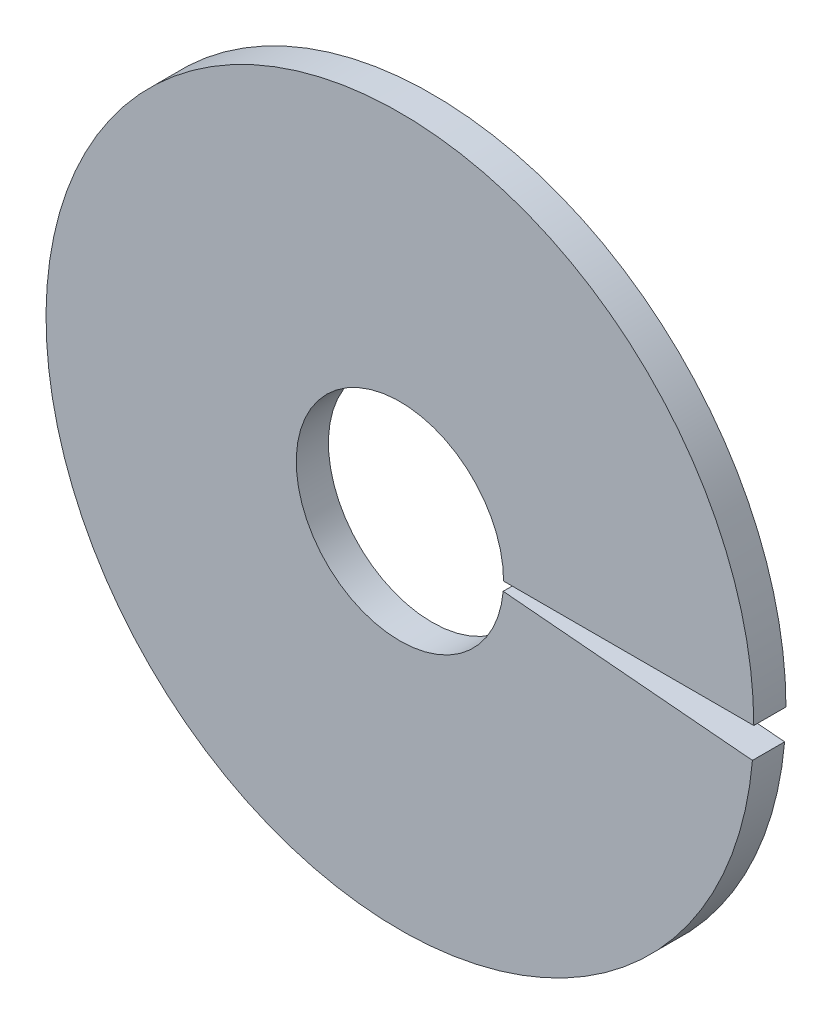
ISO-10303-21;
HEADER;
FILE_DESCRIPTION(('STEP AP214'),'2;1');
FILE_NAME('part.step','',(''),(''),'','','');
FILE_SCHEMA(('AUTOMOTIVE_DESIGN { 1 0 10303 214 1 1 1 1 }'));
ENDSEC;
DATA;
#1=APPLICATION_CONTEXT('core data for automotive mechanical design processes');
#2=APPLICATION_PROTOCOL_DEFINITION('international standard','automotive_design',2000,#1);
#3=PRODUCT_CONTEXT('',#1,'mechanical');
#4=PRODUCT('Part','Part','',(#3));
#5=PRODUCT_RELATED_PRODUCT_CATEGORY('part','',(#4));
#6=PRODUCT_DEFINITION_FORMATION('','',#4);
#7=PRODUCT_DEFINITION_CONTEXT('part definition',#1,'design');
#8=PRODUCT_DEFINITION('design','',#6,#7);
#9=PRODUCT_DEFINITION_SHAPE('','',#8);
#10=(LENGTH_UNIT() NAMED_UNIT(*) SI_UNIT(.MILLI.,.METRE.));
#11=(NAMED_UNIT(*) PLANE_ANGLE_UNIT() SI_UNIT($,.RADIAN.));
#12=(NAMED_UNIT(*) SI_UNIT($,.STERADIAN.) SOLID_ANGLE_UNIT());
#13=UNCERTAINTY_MEASURE_WITH_UNIT(LENGTH_MEASURE(1.E-05),#10,'distance_accuracy_value','');
#14=(GEOMETRIC_REPRESENTATION_CONTEXT(3) GLOBAL_UNCERTAINTY_ASSIGNED_CONTEXT((#13)) GLOBAL_UNIT_ASSIGNED_CONTEXT((#10,
#11,#12)) REPRESENTATION_CONTEXT('',''));
#15=CARTESIAN_POINT('',(0.,0.,0.));
#16=DIRECTION('',(0.,0.,1.));
#17=DIRECTION('',(1.,0.,0.));
#18=AXIS2_PLACEMENT_3D('',#15,#16,#17);
#19=CARTESIAN_POINT('',(0.,0.,-2.35158147532483));
#20=DIRECTION('',(0.,0.,-1.));
#21=DIRECTION('',(-1.,0.,0.));
#22=AXIS2_PLACEMENT_3D('',#19,#20,#21);
#23=CYLINDRICAL_SURFACE('',#22,2.9);
#24=CARTESIAN_POINT('',(0.,0.,-0.851281475324825));
#25=DIRECTION('',(0.,0.,-1.));
#26=DIRECTION('',(-1.,0.,0.));
#27=AXIS2_PLACEMENT_3D('',#24,#25,#26);
#28=CIRCLE('',#27,2.9);
#29=CARTESIAN_POINT('',(2.88896462446607,-0.252751653968166,-0.851281475324825));
#30=VERTEX_POINT('',#29);
#31=CARTESIAN_POINT('',(2.9,0.,-0.851281475324825));
#32=VERTEX_POINT('',#31);
#33=EDGE_CURVE('E11',#30,#32,#28,.T.);
#34=ORIENTED_EDGE('',*,*,#33,.T.);
#35=DIRECTION('',(0.,0.,1.));
#36=VECTOR('',#35,1.);
#37=CARTESIAN_POINT('',(2.9,0.,0.0487185246751745));
#38=LINE('',#37,#36);
#39=CARTESIAN_POINT('',(2.9,0.,0.0487185246751745));
#40=VERTEX_POINT('',#39);
#41=EDGE_CURVE('E103',#32,#40,#38,.T.);
#42=ORIENTED_EDGE('',*,*,#41,.T.);
#43=CARTESIAN_POINT('',(0.,0.,0.0487185246751745));
#44=DIRECTION('',(0.,0.,-1.));
#45=DIRECTION('',(-1.,0.,0.));
#46=AXIS2_PLACEMENT_3D('',#43,#44,#45);
#47=CIRCLE('',#46,2.9);
#48=CARTESIAN_POINT('',(2.88896462446607,-0.252751653968166,0.0487185246751745));
#49=VERTEX_POINT('',#48);
#50=EDGE_CURVE('E84',#49,#40,#47,.T.);
#51=ORIENTED_EDGE('',*,*,#50,.F.);
#52=DIRECTION('',(0.,0.,1.));
#53=VECTOR('',#52,1.);
#54=CARTESIAN_POINT('',(2.88896462446607,-0.252751653968166,0.0487185246751745));
#55=LINE('',#54,#53);
#56=EDGE_CURVE('E115',#30,#49,#55,.T.);
#57=ORIENTED_EDGE('',*,*,#56,.F.);
#58=EDGE_LOOP('',(#34,#42,#51,#57));
#59=FACE_BOUND('',#58,.T.);
#60=ADVANCED_FACE('F43',(#59),#23,.F.);
#61=CARTESIAN_POINT('',(2.88896462446607,-0.252751653968166,-0.851281475324825));
#62=DIRECTION('',(0.,0.,1.));
#63=DIRECTION('',(1.,0.,0.));
#64=AXIS2_PLACEMENT_3D('',#61,#62,#63);
#65=PLANE('',#64);
#66=CARTESIAN_POINT('',(0.,0.,-0.851281475324825));
#67=DIRECTION('',(0.,0.,-1.));
#68=DIRECTION('',(-1.,0.,0.));
#69=AXIS2_PLACEMENT_3D('',#66,#67,#68);
#70=CIRCLE('',#69,9.9);
#71=CARTESIAN_POINT('',(9.86232751110829,-0.862841853201668,-0.851281475324825));
#72=VERTEX_POINT('',#71);
#73=CARTESIAN_POINT('',(9.9,0.,-0.851281475324825));
#74=VERTEX_POINT('',#73);
#75=EDGE_CURVE('E52',#72,#74,#70,.T.);
#76=ORIENTED_EDGE('',*,*,#75,.T.);
#77=DIRECTION('',(-1.,0.,0.));
#78=VECTOR('',#77,1.);
#79=CARTESIAN_POINT('',(2.9,0.,-0.851281475324825));
#80=LINE('',#79,#78);
#81=EDGE_CURVE('E112',#74,#32,#80,.T.);
#82=ORIENTED_EDGE('',*,*,#81,.T.);
#83=ORIENTED_EDGE('',*,*,#33,.F.);
#84=DIRECTION('',(-0.996194698091747,0.0871557427476433,0.));
#85=VECTOR('',#84,1.);
#86=CARTESIAN_POINT('',(2.88896462446607,-0.252751653968166,-0.851281475324825));
#87=LINE('',#86,#85);
#88=EDGE_CURVE('E97',#72,#30,#87,.T.);
#89=ORIENTED_EDGE('',*,*,#88,.F.);
#90=EDGE_LOOP('',(#76,#82,#83,#89));
#91=FACE_BOUND('',#90,.T.);
#92=ADVANCED_FACE('F45',(#91),#65,.F.);
#93=CARTESIAN_POINT('',(0.,0.,-2.35158147532483));
#94=DIRECTION('',(0.,0.,-1.));
#95=DIRECTION('',(-1.,0.,0.));
#96=AXIS2_PLACEMENT_3D('',#93,#94,#95);
#97=CYLINDRICAL_SURFACE('',#96,9.9);
#98=CARTESIAN_POINT('',(0.,0.,0.0487185246751745));
#99=DIRECTION('',(0.,0.,-1.));
#100=DIRECTION('',(-1.,0.,0.));
#101=AXIS2_PLACEMENT_3D('',#98,#99,#100);
#102=CIRCLE('',#101,9.9);
#103=CARTESIAN_POINT('',(9.86232751110829,-0.862841853201668,0.0487185246751745));
#104=VERTEX_POINT('',#103);
#105=CARTESIAN_POINT('',(9.9,0.,0.0487185246751745));
#106=VERTEX_POINT('',#105);
#107=EDGE_CURVE('E96',#104,#106,#102,.T.);
#108=ORIENTED_EDGE('',*,*,#107,.T.);
#109=DIRECTION('',(0.,0.,-1.));
#110=VECTOR('',#109,1.);
#111=CARTESIAN_POINT('',(9.9,0.,0.0487185246751745));
#112=LINE('',#111,#110);
#113=EDGE_CURVE('E104',#106,#74,#112,.T.);
#114=ORIENTED_EDGE('',*,*,#113,.T.);
#115=ORIENTED_EDGE('',*,*,#75,.F.);
#116=DIRECTION('',(0.,0.,-1.));
#117=VECTOR('',#116,1.);
#118=CARTESIAN_POINT('',(9.86232751110829,-0.862841853201668,0.0487185246751745));
#119=LINE('',#118,#117);
#120=EDGE_CURVE('E120',#104,#72,#119,.T.);
#121=ORIENTED_EDGE('',*,*,#120,.F.);
#122=EDGE_LOOP('',(#108,#114,#115,#121));
#123=FACE_BOUND('',#122,.T.);
#124=ADVANCED_FACE('F127',(#123),#97,.T.);
#125=CARTESIAN_POINT('',(2.88896462446607,-0.252751653968166,0.0487185246751745));
#126=DIRECTION('',(0.,0.,-1.));
#127=DIRECTION('',(-1.,0.,0.));
#128=AXIS2_PLACEMENT_3D('',#125,#126,#127);
#129=PLANE('',#128);
#130=DIRECTION('',(0.996194698091747,-0.0871557427476433,0.));
#131=VECTOR('',#130,1.);
#132=CARTESIAN_POINT('',(2.88896462446607,-0.252751653968166,0.0487185246751745));
#133=LINE('',#132,#131);
#134=EDGE_CURVE('E90',#49,#104,#133,.T.);
#135=ORIENTED_EDGE('',*,*,#134,.F.);
#136=ORIENTED_EDGE('',*,*,#50,.T.);
#137=DIRECTION('',(1.,0.,0.));
#138=VECTOR('',#137,1.);
#139=CARTESIAN_POINT('',(2.9,0.,0.0487185246751745));
#140=LINE('',#139,#138);
#141=EDGE_CURVE('E87',#40,#106,#140,.T.);
#142=ORIENTED_EDGE('',*,*,#141,.T.);
#143=ORIENTED_EDGE('',*,*,#107,.F.);
#144=EDGE_LOOP('',(#135,#136,#142,#143));
#145=FACE_BOUND('',#144,.T.);
#146=ADVANCED_FACE('F86',(#145),#129,.F.);
#147=CARTESIAN_POINT('',(0.,0.,0.));
#148=DIRECTION('',(-0.0871557427476433,-0.996194698091747,0.));
#149=DIRECTION('',(0.,0.,-1.));
#150=AXIS2_PLACEMENT_3D('',#147,#148,#149);
#151=PLANE('',#150);
#152=ORIENTED_EDGE('',*,*,#56,.T.);
#153=ORIENTED_EDGE('',*,*,#134,.T.);
#154=ORIENTED_EDGE('',*,*,#120,.T.);
#155=ORIENTED_EDGE('',*,*,#88,.T.);
#156=EDGE_LOOP('',(#152,#153,#154,#155));
#157=FACE_BOUND('',#156,.T.);
#158=ADVANCED_FACE('F129',(#157),#151,.F.);
#159=CARTESIAN_POINT('',(0.,0.,0.));
#160=DIRECTION('',(0.,-1.,0.));
#161=DIRECTION('',(0.,0.,-1.));
#162=AXIS2_PLACEMENT_3D('',#159,#160,#161);
#163=PLANE('',#162);
#164=ORIENTED_EDGE('',*,*,#41,.F.);
#165=ORIENTED_EDGE('',*,*,#81,.F.);
#166=ORIENTED_EDGE('',*,*,#113,.F.);
#167=ORIENTED_EDGE('',*,*,#141,.F.);
#168=EDGE_LOOP('',(#164,#165,#166,#167));
#169=FACE_BOUND('',#168,.T.);
#170=ADVANCED_FACE('F101',(#169),#163,.T.);
#171=CLOSED_SHELL('',(#60,#92,#124,#146,#158,#170));
#172=MANIFOLD_SOLID_BREP('B2',#171);
#173=ADVANCED_BREP_SHAPE_REPRESENTATION('',(#18,#172),#14);
#174=SHAPE_DEFINITION_REPRESENTATION(#9,#173);
ENDSEC;
END-ISO-10303-21;
